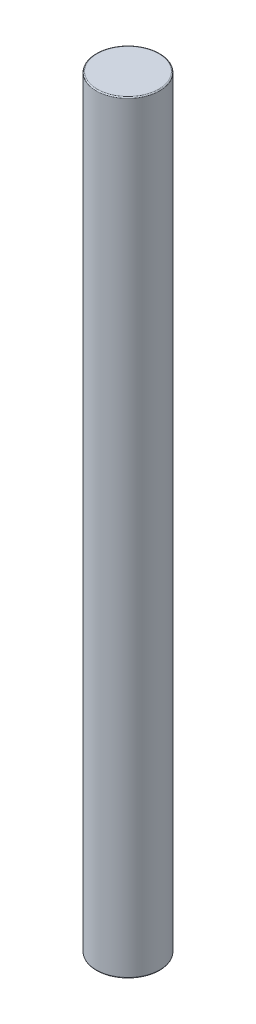
ISO-10303-21;
HEADER;
FILE_DESCRIPTION(('STEP AP214'),'2;1');
FILE_NAME('part.step','',(''),(''),'','','');
FILE_SCHEMA(('AUTOMOTIVE_DESIGN { 1 0 10303 214 1 1 1 1 }'));
ENDSEC;
DATA;
#1=APPLICATION_CONTEXT('core data for automotive mechanical design processes');
#2=APPLICATION_PROTOCOL_DEFINITION('international standard','automotive_design',2000,#1);
#3=PRODUCT_CONTEXT('',#1,'mechanical');
#4=PRODUCT('Part','Part','',(#3));
#5=PRODUCT_RELATED_PRODUCT_CATEGORY('part','',(#4));
#6=PRODUCT_DEFINITION_FORMATION('','',#4);
#7=PRODUCT_DEFINITION_CONTEXT('part definition',#1,'design');
#8=PRODUCT_DEFINITION('design','',#6,#7);
#9=PRODUCT_DEFINITION_SHAPE('','',#8);
#10=(LENGTH_UNIT() NAMED_UNIT(*) SI_UNIT(.MILLI.,.METRE.));
#11=(NAMED_UNIT(*) PLANE_ANGLE_UNIT() SI_UNIT($,.RADIAN.));
#12=(NAMED_UNIT(*) SI_UNIT($,.STERADIAN.) SOLID_ANGLE_UNIT());
#13=UNCERTAINTY_MEASURE_WITH_UNIT(LENGTH_MEASURE(1.E-05),#10,'distance_accuracy_value','');
#14=(GEOMETRIC_REPRESENTATION_CONTEXT(3) GLOBAL_UNCERTAINTY_ASSIGNED_CONTEXT((#13)) GLOBAL_UNIT_ASSIGNED_CONTEXT((#10,
#11,#12)) REPRESENTATION_CONTEXT('',''));
#15=CARTESIAN_POINT('',(0.,0.,0.));
#16=DIRECTION('',(0.,0.,1.));
#17=DIRECTION('',(1.,0.,0.));
#18=AXIS2_PLACEMENT_3D('',#15,#16,#17);
#19=CARTESIAN_POINT('',(0.,1828.8,0.));
#20=DIRECTION('',(0.,-1.,0.));
#21=DIRECTION('',(0.,0.,-1.));
#22=AXIS2_PLACEMENT_3D('',#19,#20,#21);
#23=CYLINDRICAL_SURFACE('',#22,76.2);
#24=CARTESIAN_POINT('',(0.,2.53999999999999,0.));
#25=DIRECTION('',(0.,1.,0.));
#26=DIRECTION('',(0.,0.,1.));
#27=AXIS2_PLACEMENT_3D('',#24,#25,#26);
#28=CIRCLE('',#27,76.2);
#29=CARTESIAN_POINT('',(0.,2.53999999999999,76.2));
#30=VERTEX_POINT('',#29);
#31=EDGE_CURVE('E50',#30,#30,#28,.T.);
#32=ORIENTED_EDGE('',*,*,#31,.T.);
#33=EDGE_LOOP('',(#32));
#34=FACE_BOUND('',#33,.T.);
#35=CARTESIAN_POINT('',(0.,1826.26,0.));
#36=DIRECTION('',(0.,1.,0.));
#37=DIRECTION('',(0.,0.,1.));
#38=AXIS2_PLACEMENT_3D('',#35,#36,#37);
#39=CIRCLE('',#38,76.2);
#40=CARTESIAN_POINT('',(0.,1826.26,76.2));
#41=VERTEX_POINT('',#40);
#42=EDGE_CURVE('E55',#41,#41,#39,.F.);
#43=ORIENTED_EDGE('',*,*,#42,.T.);
#44=EDGE_LOOP('',(#43));
#45=FACE_BOUND('',#44,.T.);
#46=ADVANCED_FACE('F37',(#34,#45),#23,.T.);
#47=CARTESIAN_POINT('',(0.,1828.8,0.));
#48=DIRECTION('',(0.,1.,0.));
#49=DIRECTION('',(0.,0.,1.));
#50=AXIS2_PLACEMENT_3D('',#47,#48,#49);
#51=PLANE('',#50);
#52=CARTESIAN_POINT('',(0.,1828.8,0.));
#53=DIRECTION('',(0.,1.,0.));
#54=DIRECTION('',(0.,0.,1.));
#55=AXIS2_PLACEMENT_3D('',#52,#53,#54);
#56=CIRCLE('',#55,73.66);
#57=CARTESIAN_POINT('',(0.,1828.8,73.66));
#58=VERTEX_POINT('',#57);
#59=EDGE_CURVE('E10',#58,#58,#56,.T.);
#60=ORIENTED_EDGE('',*,*,#59,.T.);
#61=EDGE_LOOP('',(#60));
#62=FACE_BOUND('',#61,.T.);
#63=ADVANCED_FACE('F72',(#62),#51,.T.);
#64=CARTESIAN_POINT('',(0.,0.,0.));
#65=DIRECTION('',(0.,1.,0.));
#66=DIRECTION('',(0.,0.,1.));
#67=AXIS2_PLACEMENT_3D('',#64,#65,#66);
#68=PLANE('',#67);
#69=CARTESIAN_POINT('',(0.,0.,0.));
#70=DIRECTION('',(0.,1.,0.));
#71=DIRECTION('',(0.,0.,1.));
#72=AXIS2_PLACEMENT_3D('',#69,#70,#71);
#73=CIRCLE('',#72,73.66);
#74=CARTESIAN_POINT('',(0.,0.,73.66));
#75=VERTEX_POINT('',#74);
#76=EDGE_CURVE('E45',#75,#75,#73,.F.);
#77=ORIENTED_EDGE('',*,*,#76,.T.);
#78=EDGE_LOOP('',(#77));
#79=FACE_BOUND('',#78,.T.);
#80=ADVANCED_FACE('F69',(#79),#68,.F.);
#81=CARTESIAN_POINT('',(0.,2.53999999999999,0.));
#82=DIRECTION('',(0.,1.,0.));
#83=DIRECTION('',(0.,0.,1.));
#84=AXIS2_PLACEMENT_3D('',#81,#82,#83);
#85=TOROIDAL_SURFACE('',#84,73.66,2.54);
#86=ORIENTED_EDGE('',*,*,#76,.F.);
#87=EDGE_LOOP('',(#86));
#88=FACE_BOUND('',#87,.T.);
#89=ORIENTED_EDGE('',*,*,#31,.F.);
#90=EDGE_LOOP('',(#89));
#91=FACE_BOUND('',#90,.T.);
#92=ADVANCED_FACE('F65',(#88,#91),#85,.T.);
#93=CARTESIAN_POINT('',(0.,1826.26,0.));
#94=DIRECTION('',(0.,1.,0.));
#95=DIRECTION('',(0.,0.,1.));
#96=AXIS2_PLACEMENT_3D('',#93,#94,#95);
#97=TOROIDAL_SURFACE('',#96,73.66,2.54);
#98=ORIENTED_EDGE('',*,*,#42,.F.);
#99=EDGE_LOOP('',(#98));
#100=FACE_BOUND('',#99,.T.);
#101=ORIENTED_EDGE('',*,*,#59,.F.);
#102=EDGE_LOOP('',(#101));
#103=FACE_BOUND('',#102,.T.);
#104=ADVANCED_FACE('F39',(#100,#103),#97,.T.);
#105=CLOSED_SHELL('',(#46,#63,#80,#92,#104));
#106=MANIFOLD_SOLID_BREP('B2',#105);
#107=ADVANCED_BREP_SHAPE_REPRESENTATION('',(#18,#106),#14);
#108=SHAPE_DEFINITION_REPRESENTATION(#9,#107);
ENDSEC;
END-ISO-10303-21;
